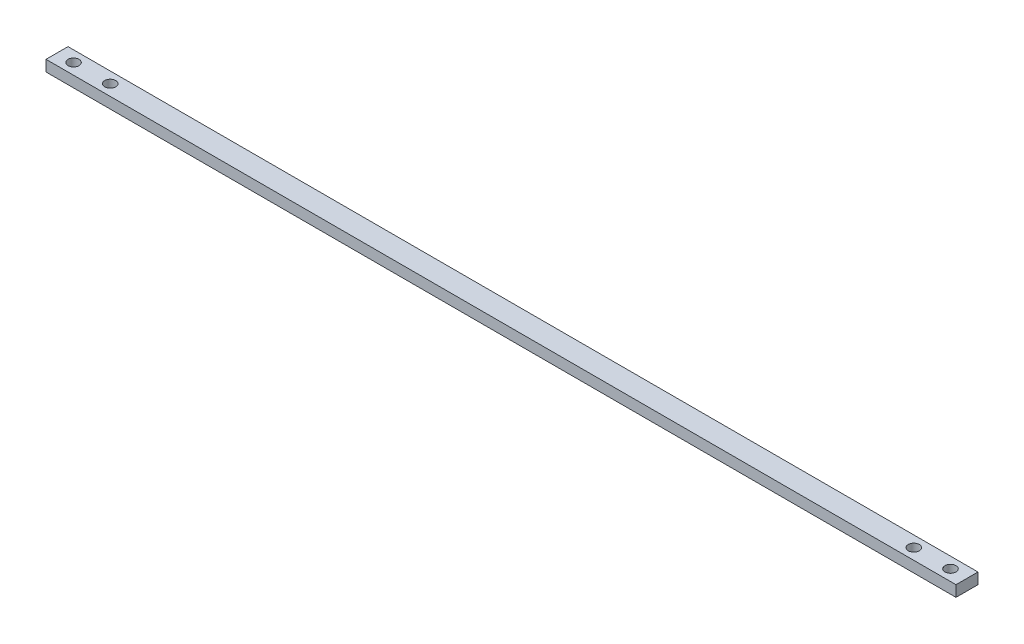
ISO-10303-21;
HEADER;
FILE_DESCRIPTION(('STEP AP214'),'2;1');
FILE_NAME('part.step','',(''),(''),'','','');
FILE_SCHEMA(('AUTOMOTIVE_DESIGN { 1 0 10303 214 1 1 1 1 }'));
ENDSEC;
DATA;
#1=APPLICATION_CONTEXT('core data for automotive mechanical design processes');
#2=APPLICATION_PROTOCOL_DEFINITION('international standard','automotive_design',2000,#1);
#3=PRODUCT_CONTEXT('',#1,'mechanical');
#4=PRODUCT('Part','Part','',(#3));
#5=PRODUCT_RELATED_PRODUCT_CATEGORY('part','',(#4));
#6=PRODUCT_DEFINITION_FORMATION('','',#4);
#7=PRODUCT_DEFINITION_CONTEXT('part definition',#1,'design');
#8=PRODUCT_DEFINITION('design','',#6,#7);
#9=PRODUCT_DEFINITION_SHAPE('','',#8);
#10=(LENGTH_UNIT() NAMED_UNIT(*) SI_UNIT(.MILLI.,.METRE.));
#11=(NAMED_UNIT(*) PLANE_ANGLE_UNIT() SI_UNIT($,.RADIAN.));
#12=(NAMED_UNIT(*) SI_UNIT($,.STERADIAN.) SOLID_ANGLE_UNIT());
#13=UNCERTAINTY_MEASURE_WITH_UNIT(LENGTH_MEASURE(1.E-05),#10,'distance_accuracy_value','');
#14=(GEOMETRIC_REPRESENTATION_CONTEXT(3) GLOBAL_UNCERTAINTY_ASSIGNED_CONTEXT((#13)) GLOBAL_UNIT_ASSIGNED_CONTEXT((#10,
#11,#12)) REPRESENTATION_CONTEXT('',''));
#15=CARTESIAN_POINT('',(0.,0.,0.));
#16=DIRECTION('',(0.,0.,1.));
#17=DIRECTION('',(1.,0.,0.));
#18=AXIS2_PLACEMENT_3D('',#15,#16,#17);
#19=CARTESIAN_POINT('',(0.,3.,0.));
#20=DIRECTION('',(0.,-1.,0.));
#21=DIRECTION('',(0.,0.,-1.));
#22=AXIS2_PLACEMENT_3D('',#19,#20,#21);
#23=PLANE('',#22);
#24=DIRECTION('',(0.,0.,-1.));
#25=VECTOR('',#24,1.);
#26=CARTESIAN_POINT('',(124.,3.,3.));
#27=LINE('',#26,#25);
#28=CARTESIAN_POINT('',(124.,3.,3.));
#29=VERTEX_POINT('',#28);
#30=CARTESIAN_POINT('',(124.,3.,-3.));
#31=VERTEX_POINT('',#30);
#32=EDGE_CURVE('E88',#29,#31,#27,.T.);
#33=ORIENTED_EDGE('',*,*,#32,.T.);
#34=DIRECTION('',(-1.,0.,0.));
#35=VECTOR('',#34,1.);
#36=CARTESIAN_POINT('',(-124.,3.,-3.));
#37=LINE('',#36,#35);
#38=CARTESIAN_POINT('',(-124.,3.,-3.));
#39=VERTEX_POINT('',#38);
#40=EDGE_CURVE('E83',#31,#39,#37,.T.);
#41=ORIENTED_EDGE('',*,*,#40,.T.);
#42=DIRECTION('',(0.,0.,1.));
#43=VECTOR('',#42,1.);
#44=CARTESIAN_POINT('',(-124.,3.,3.));
#45=LINE('',#44,#43);
#46=CARTESIAN_POINT('',(-124.,3.,3.));
#47=VERTEX_POINT('',#46);
#48=EDGE_CURVE('E86',#39,#47,#45,.T.);
#49=ORIENTED_EDGE('',*,*,#48,.T.);
#50=DIRECTION('',(1.,0.,0.));
#51=VECTOR('',#50,1.);
#52=CARTESIAN_POINT('',(-124.,3.,3.));
#53=LINE('',#52,#51);
#54=EDGE_CURVE('E53',#47,#29,#53,.T.);
#55=ORIENTED_EDGE('',*,*,#54,.T.);
#56=EDGE_LOOP('',(#33,#41,#49,#55));
#57=FACE_BOUND('',#56,.T.);
#58=CARTESIAN_POINT('',(-119.5,3.,0.));
#59=DIRECTION('',(0.,1.,0.));
#60=DIRECTION('',(0.,0.,1.));
#61=AXIS2_PLACEMENT_3D('',#58,#59,#60);
#62=CIRCLE('',#61,1.5);
#63=CARTESIAN_POINT('',(-119.5,3.,1.50000000000001));
#64=VERTEX_POINT('',#63);
#65=EDGE_CURVE('E103',#64,#64,#62,.T.);
#66=ORIENTED_EDGE('',*,*,#65,.F.);
#67=EDGE_LOOP('',(#66));
#68=FACE_BOUND('',#67,.T.);
#69=CARTESIAN_POINT('',(119.5,3.,0.));
#70=DIRECTION('',(0.,1.,0.));
#71=DIRECTION('',(0.,0.,-1.));
#72=AXIS2_PLACEMENT_3D('',#69,#70,#71);
#73=CIRCLE('',#72,1.5);
#74=CARTESIAN_POINT('',(119.5,3.,-1.49999999999999));
#75=VERTEX_POINT('',#74);
#76=EDGE_CURVE('E118',#75,#75,#73,.T.);
#77=ORIENTED_EDGE('',*,*,#76,.F.);
#78=EDGE_LOOP('',(#77));
#79=FACE_BOUND('',#78,.T.);
#80=CARTESIAN_POINT('',(-109.5,3.,0.));
#81=DIRECTION('',(0.,1.,0.));
#82=DIRECTION('',(0.,0.,1.));
#83=AXIS2_PLACEMENT_3D('',#80,#81,#82);
#84=CIRCLE('',#83,1.5);
#85=CARTESIAN_POINT('',(-109.5,3.,1.50000000000001));
#86=VERTEX_POINT('',#85);
#87=EDGE_CURVE('E124',#86,#86,#84,.T.);
#88=ORIENTED_EDGE('',*,*,#87,.F.);
#89=EDGE_LOOP('',(#88));
#90=FACE_BOUND('',#89,.T.);
#91=CARTESIAN_POINT('',(109.5,3.,0.));
#92=DIRECTION('',(0.,1.,0.));
#93=DIRECTION('',(0.,0.,-1.));
#94=AXIS2_PLACEMENT_3D('',#91,#92,#93);
#95=CIRCLE('',#94,1.5);
#96=CARTESIAN_POINT('',(109.5,3.,-1.49999999999992));
#97=VERTEX_POINT('',#96);
#98=EDGE_CURVE('E130',#97,#97,#95,.T.);
#99=ORIENTED_EDGE('',*,*,#98,.F.);
#100=EDGE_LOOP('',(#99));
#101=FACE_BOUND('',#100,.T.);
#102=ADVANCED_FACE('F36',(#57,#68,#79,#90,#101),#23,.F.);
#103=CARTESIAN_POINT('',(0.,0.,0.));
#104=DIRECTION('',(0.,-1.,0.));
#105=DIRECTION('',(0.,0.,-1.));
#106=AXIS2_PLACEMENT_3D('',#103,#104,#105);
#107=PLANE('',#106);
#108=CARTESIAN_POINT('',(-109.5,0.,0.));
#109=DIRECTION('',(0.,1.,0.));
#110=DIRECTION('',(0.,0.,1.));
#111=AXIS2_PLACEMENT_3D('',#108,#109,#110);
#112=CIRCLE('',#111,1.5);
#113=CARTESIAN_POINT('',(-109.5,0.,1.50000000000001));
#114=VERTEX_POINT('',#113);
#115=EDGE_CURVE('E127',#114,#114,#112,.T.);
#116=ORIENTED_EDGE('',*,*,#115,.T.);
#117=EDGE_LOOP('',(#116));
#118=FACE_BOUND('',#117,.T.);
#119=CARTESIAN_POINT('',(-119.5,0.,0.));
#120=DIRECTION('',(0.,1.,0.));
#121=DIRECTION('',(0.,0.,1.));
#122=AXIS2_PLACEMENT_3D('',#119,#120,#121);
#123=CIRCLE('',#122,1.5);
#124=CARTESIAN_POINT('',(-119.5,0.,1.50000000000001));
#125=VERTEX_POINT('',#124);
#126=EDGE_CURVE('E115',#125,#125,#123,.T.);
#127=ORIENTED_EDGE('',*,*,#126,.T.);
#128=EDGE_LOOP('',(#127));
#129=FACE_BOUND('',#128,.T.);
#130=DIRECTION('',(0.,0.,-1.));
#131=VECTOR('',#130,1.);
#132=CARTESIAN_POINT('',(124.,0.,3.));
#133=LINE('',#132,#131);
#134=CARTESIAN_POINT('',(124.,0.,3.));
#135=VERTEX_POINT('',#134);
#136=CARTESIAN_POINT('',(124.,0.,-3.));
#137=VERTEX_POINT('',#136);
#138=EDGE_CURVE('E100',#135,#137,#133,.T.);
#139=ORIENTED_EDGE('',*,*,#138,.F.);
#140=DIRECTION('',(1.,0.,0.));
#141=VECTOR('',#140,1.);
#142=CARTESIAN_POINT('',(-124.,0.,3.));
#143=LINE('',#142,#141);
#144=CARTESIAN_POINT('',(-124.,0.,3.));
#145=VERTEX_POINT('',#144);
#146=EDGE_CURVE('E76',#145,#135,#143,.T.);
#147=ORIENTED_EDGE('',*,*,#146,.F.);
#148=DIRECTION('',(0.,0.,1.));
#149=VECTOR('',#148,1.);
#150=CARTESIAN_POINT('',(-124.,0.,3.));
#151=LINE('',#150,#149);
#152=CARTESIAN_POINT('',(-124.,0.,-3.));
#153=VERTEX_POINT('',#152);
#154=EDGE_CURVE('E70',#153,#145,#151,.T.);
#155=ORIENTED_EDGE('',*,*,#154,.F.);
#156=DIRECTION('',(-1.,0.,0.));
#157=VECTOR('',#156,1.);
#158=CARTESIAN_POINT('',(-124.,0.,-3.));
#159=LINE('',#158,#157);
#160=EDGE_CURVE('E92',#137,#153,#159,.T.);
#161=ORIENTED_EDGE('',*,*,#160,.F.);
#162=EDGE_LOOP('',(#139,#147,#155,#161));
#163=FACE_BOUND('',#162,.T.);
#164=CARTESIAN_POINT('',(119.5,0.,0.));
#165=DIRECTION('',(0.,1.,0.));
#166=DIRECTION('',(0.,0.,-1.));
#167=AXIS2_PLACEMENT_3D('',#164,#165,#166);
#168=CIRCLE('',#167,1.5);
#169=CARTESIAN_POINT('',(119.5,0.,-1.49999999999999));
#170=VERTEX_POINT('',#169);
#171=EDGE_CURVE('E121',#170,#170,#168,.T.);
#172=ORIENTED_EDGE('',*,*,#171,.T.);
#173=EDGE_LOOP('',(#172));
#174=FACE_BOUND('',#173,.T.);
#175=CARTESIAN_POINT('',(109.5,0.,0.));
#176=DIRECTION('',(0.,1.,0.));
#177=DIRECTION('',(0.,0.,-1.));
#178=AXIS2_PLACEMENT_3D('',#175,#176,#177);
#179=CIRCLE('',#178,1.5);
#180=CARTESIAN_POINT('',(109.5,0.,-1.49999999999992));
#181=VERTEX_POINT('',#180);
#182=EDGE_CURVE('E133',#181,#181,#179,.T.);
#183=ORIENTED_EDGE('',*,*,#182,.T.);
#184=EDGE_LOOP('',(#183));
#185=FACE_BOUND('',#184,.T.);
#186=ADVANCED_FACE('F111',(#118,#129,#163,#174,#185),#107,.T.);
#187=CARTESIAN_POINT('',(124.,3.,3.));
#188=DIRECTION('',(-1.,0.,0.));
#189=DIRECTION('',(0.,0.,1.));
#190=AXIS2_PLACEMENT_3D('',#187,#188,#189);
#191=PLANE('',#190);
#192=ORIENTED_EDGE('',*,*,#138,.T.);
#193=DIRECTION('',(0.,-1.,0.));
#194=VECTOR('',#193,1.);
#195=CARTESIAN_POINT('',(124.,3.,-3.));
#196=LINE('',#195,#194);
#197=EDGE_CURVE('E11',#31,#137,#196,.T.);
#198=ORIENTED_EDGE('',*,*,#197,.F.);
#199=ORIENTED_EDGE('',*,*,#32,.F.);
#200=DIRECTION('',(0.,-1.,0.));
#201=VECTOR('',#200,1.);
#202=CARTESIAN_POINT('',(124.,3.,3.));
#203=LINE('',#202,#201);
#204=EDGE_CURVE('E96',#29,#135,#203,.T.);
#205=ORIENTED_EDGE('',*,*,#204,.T.);
#206=EDGE_LOOP('',(#192,#198,#199,#205));
#207=FACE_BOUND('',#206,.T.);
#208=ADVANCED_FACE('F38',(#207),#191,.F.);
#209=CARTESIAN_POINT('',(-124.,3.,-3.));
#210=DIRECTION('',(0.,0.,1.));
#211=DIRECTION('',(1.,0.,0.));
#212=AXIS2_PLACEMENT_3D('',#209,#210,#211);
#213=PLANE('',#212);
#214=ORIENTED_EDGE('',*,*,#160,.T.);
#215=DIRECTION('',(0.,-1.,0.));
#216=VECTOR('',#215,1.);
#217=CARTESIAN_POINT('',(-124.,3.,-3.));
#218=LINE('',#217,#216);
#219=EDGE_CURVE('E45',#39,#153,#218,.T.);
#220=ORIENTED_EDGE('',*,*,#219,.F.);
#221=ORIENTED_EDGE('',*,*,#40,.F.);
#222=ORIENTED_EDGE('',*,*,#197,.T.);
#223=EDGE_LOOP('',(#214,#220,#221,#222));
#224=FACE_BOUND('',#223,.T.);
#225=ADVANCED_FACE('F91',(#224),#213,.F.);
#226=CARTESIAN_POINT('',(-124.,3.,3.));
#227=DIRECTION('',(1.,0.,0.));
#228=DIRECTION('',(0.,0.,-1.));
#229=AXIS2_PLACEMENT_3D('',#226,#227,#228);
#230=PLANE('',#229);
#231=ORIENTED_EDGE('',*,*,#154,.T.);
#232=DIRECTION('',(0.,-1.,0.));
#233=VECTOR('',#232,1.);
#234=CARTESIAN_POINT('',(-124.,3.,3.));
#235=LINE('',#234,#233);
#236=EDGE_CURVE('E93',#47,#145,#235,.T.);
#237=ORIENTED_EDGE('',*,*,#236,.F.);
#238=ORIENTED_EDGE('',*,*,#48,.F.);
#239=ORIENTED_EDGE('',*,*,#219,.T.);
#240=EDGE_LOOP('',(#231,#237,#238,#239));
#241=FACE_BOUND('',#240,.T.);
#242=ADVANCED_FACE('F94',(#241),#230,.F.);
#243=CARTESIAN_POINT('',(-124.,3.,3.));
#244=DIRECTION('',(0.,0.,-1.));
#245=DIRECTION('',(-1.,0.,0.));
#246=AXIS2_PLACEMENT_3D('',#243,#244,#245);
#247=PLANE('',#246);
#248=ORIENTED_EDGE('',*,*,#146,.T.);
#249=ORIENTED_EDGE('',*,*,#204,.F.);
#250=ORIENTED_EDGE('',*,*,#54,.F.);
#251=ORIENTED_EDGE('',*,*,#236,.T.);
#252=EDGE_LOOP('',(#248,#249,#250,#251));
#253=FACE_BOUND('',#252,.T.);
#254=ADVANCED_FACE('F108',(#253),#247,.F.);
#255=CARTESIAN_POINT('',(-119.5,3.,0.));
#256=DIRECTION('',(0.,-1.,0.));
#257=DIRECTION('',(0.,0.,-1.));
#258=AXIS2_PLACEMENT_3D('',#255,#256,#257);
#259=CYLINDRICAL_SURFACE('',#258,1.5);
#260=ORIENTED_EDGE('',*,*,#65,.T.);
#261=EDGE_LOOP('',(#260));
#262=FACE_BOUND('',#261,.T.);
#263=ORIENTED_EDGE('',*,*,#126,.F.);
#264=EDGE_LOOP('',(#263));
#265=FACE_BOUND('',#264,.T.);
#266=ADVANCED_FACE('F150',(#262,#265),#259,.F.);
#267=CARTESIAN_POINT('',(119.5,3.,0.));
#268=DIRECTION('',(0.,-1.,0.));
#269=DIRECTION('',(0.,0.,-1.));
#270=AXIS2_PLACEMENT_3D('',#267,#268,#269);
#271=CYLINDRICAL_SURFACE('',#270,1.5);
#272=ORIENTED_EDGE('',*,*,#76,.T.);
#273=EDGE_LOOP('',(#272));
#274=FACE_BOUND('',#273,.T.);
#275=ORIENTED_EDGE('',*,*,#171,.F.);
#276=EDGE_LOOP('',(#275));
#277=FACE_BOUND('',#276,.T.);
#278=ADVANCED_FACE('F196',(#274,#277),#271,.F.);
#279=CARTESIAN_POINT('',(-109.5,3.,0.));
#280=DIRECTION('',(0.,-1.,0.));
#281=DIRECTION('',(0.,0.,-1.));
#282=AXIS2_PLACEMENT_3D('',#279,#280,#281);
#283=CYLINDRICAL_SURFACE('',#282,1.5);
#284=ORIENTED_EDGE('',*,*,#87,.T.);
#285=EDGE_LOOP('',(#284));
#286=FACE_BOUND('',#285,.T.);
#287=ORIENTED_EDGE('',*,*,#115,.F.);
#288=EDGE_LOOP('',(#287));
#289=FACE_BOUND('',#288,.T.);
#290=ADVANCED_FACE('F204',(#286,#289),#283,.F.);
#291=CARTESIAN_POINT('',(109.5,3.,0.));
#292=DIRECTION('',(0.,-1.,0.));
#293=DIRECTION('',(0.,0.,-1.));
#294=AXIS2_PLACEMENT_3D('',#291,#292,#293);
#295=CYLINDRICAL_SURFACE('',#294,1.5);
#296=ORIENTED_EDGE('',*,*,#98,.T.);
#297=EDGE_LOOP('',(#296));
#298=FACE_BOUND('',#297,.T.);
#299=ORIENTED_EDGE('',*,*,#182,.F.);
#300=EDGE_LOOP('',(#299));
#301=FACE_BOUND('',#300,.T.);
#302=ADVANCED_FACE('F139',(#298,#301),#295,.F.);
#303=CLOSED_SHELL('',(#102,#186,#208,#225,#242,#254,#266,#278,#290,#302));
#304=MANIFOLD_SOLID_BREP('B2',#303);
#305=ADVANCED_BREP_SHAPE_REPRESENTATION('',(#18,#304),#14);
#306=SHAPE_DEFINITION_REPRESENTATION(#9,#305);
ENDSEC;
END-ISO-10303-21;
